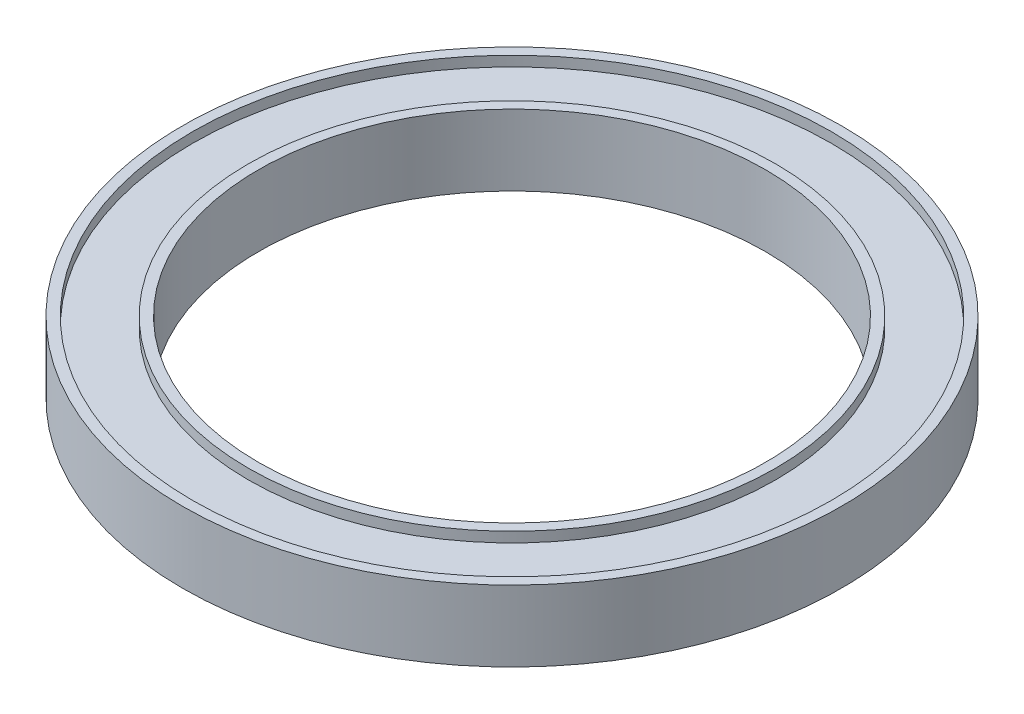
ISO-10303-21;
HEADER;
FILE_DESCRIPTION(('STEP AP214'),'2;1');
FILE_NAME('part.step','',(''),(''),'','','');
FILE_SCHEMA(('AUTOMOTIVE_DESIGN { 1 0 10303 214 1 1 1 1 }'));
ENDSEC;
DATA;
#1=APPLICATION_CONTEXT('core data for automotive mechanical design processes');
#2=APPLICATION_PROTOCOL_DEFINITION('international standard','automotive_design',2000,#1);
#3=PRODUCT_CONTEXT('',#1,'mechanical');
#4=PRODUCT('Part','Part','',(#3));
#5=PRODUCT_RELATED_PRODUCT_CATEGORY('part','',(#4));
#6=PRODUCT_DEFINITION_FORMATION('','',#4);
#7=PRODUCT_DEFINITION_CONTEXT('part definition',#1,'design');
#8=PRODUCT_DEFINITION('design','',#6,#7);
#9=PRODUCT_DEFINITION_SHAPE('','',#8);
#10=(LENGTH_UNIT() NAMED_UNIT(*) SI_UNIT(.MILLI.,.METRE.));
#11=(NAMED_UNIT(*) PLANE_ANGLE_UNIT() SI_UNIT($,.RADIAN.));
#12=(NAMED_UNIT(*) SI_UNIT($,.STERADIAN.) SOLID_ANGLE_UNIT());
#13=UNCERTAINTY_MEASURE_WITH_UNIT(LENGTH_MEASURE(1.E-05),#10,'distance_accuracy_value','');
#14=(GEOMETRIC_REPRESENTATION_CONTEXT(3) GLOBAL_UNCERTAINTY_ASSIGNED_CONTEXT((#13)) GLOBAL_UNIT_ASSIGNED_CONTEXT((#10,
#11,#12)) REPRESENTATION_CONTEXT('',''));
#15=CARTESIAN_POINT('',(0.,0.,0.));
#16=DIRECTION('',(0.,0.,1.));
#17=DIRECTION('',(1.,0.,0.));
#18=AXIS2_PLACEMENT_3D('',#15,#16,#17);
#19=CARTESIAN_POINT('',(0.,0.,0.));
#20=DIRECTION('',(0.,1.,0.));
#21=DIRECTION('',(0.,0.,1.));
#22=AXIS2_PLACEMENT_3D('',#19,#20,#21);
#23=PLANE('',#22);
#24=CARTESIAN_POINT('',(0.,0.,0.));
#25=DIRECTION('',(0.,1.,0.));
#26=DIRECTION('',(0.,0.,1.));
#27=AXIS2_PLACEMENT_3D('',#24,#25,#26);
#28=CIRCLE('',#27,25.);
#29=CARTESIAN_POINT('',(0.,0.,-25.));
#30=VERTEX_POINT('',#29);
#31=EDGE_CURVE('E44',#30,#30,#28,.T.);
#32=ORIENTED_EDGE('',*,*,#31,.T.);
#33=EDGE_LOOP('',(#32));
#34=FACE_BOUND('',#33,.T.);
#35=CARTESIAN_POINT('',(0.,0.,0.));
#36=DIRECTION('',(0.,1.,0.));
#37=DIRECTION('',(0.,0.,1.));
#38=AXIS2_PLACEMENT_3D('',#35,#36,#37);
#39=CIRCLE('',#38,26.);
#40=CARTESIAN_POINT('',(0.,0.,26.));
#41=VERTEX_POINT('',#40);
#42=EDGE_CURVE('E62',#41,#41,#39,.T.);
#43=ORIENTED_EDGE('',*,*,#42,.F.);
#44=EDGE_LOOP('',(#43));
#45=FACE_BOUND('',#44,.T.);
#46=ADVANCED_FACE('F31',(#34,#45),#23,.F.);
#47=CARTESIAN_POINT('',(0.,7.,0.));
#48=DIRECTION('',(0.,1.,0.));
#49=DIRECTION('',(0.,0.,1.));
#50=AXIS2_PLACEMENT_3D('',#47,#48,#49);
#51=PLANE('',#50);
#52=CARTESIAN_POINT('',(0.,7.,0.));
#53=DIRECTION('',(0.,1.,0.));
#54=DIRECTION('',(0.,0.,1.));
#55=AXIS2_PLACEMENT_3D('',#52,#53,#54);
#56=CIRCLE('',#55,25.);
#57=CARTESIAN_POINT('',(0.,7.,-25.));
#58=VERTEX_POINT('',#57);
#59=EDGE_CURVE('E42',#58,#58,#56,.T.);
#60=ORIENTED_EDGE('',*,*,#59,.F.);
#61=EDGE_LOOP('',(#60));
#62=FACE_BOUND('',#61,.T.);
#63=CARTESIAN_POINT('',(0.,7.,0.));
#64=DIRECTION('',(0.,1.,0.));
#65=DIRECTION('',(0.,0.,1.));
#66=AXIS2_PLACEMENT_3D('',#63,#64,#65);
#67=CIRCLE('',#66,26.);
#68=CARTESIAN_POINT('',(0.,7.,26.));
#69=VERTEX_POINT('',#68);
#70=EDGE_CURVE('E52',#69,#69,#67,.T.);
#71=ORIENTED_EDGE('',*,*,#70,.T.);
#72=EDGE_LOOP('',(#71));
#73=FACE_BOUND('',#72,.T.);
#74=ADVANCED_FACE('F88',(#62,#73),#51,.T.);
#75=CARTESIAN_POINT('',(0.,7.,0.));
#76=DIRECTION('',(0.,1.,0.));
#77=DIRECTION('',(0.,0.,1.));
#78=AXIS2_PLACEMENT_3D('',#75,#76,#77);
#79=CIRCLE('',#78,31.5);
#80=CARTESIAN_POINT('',(0.,7.,31.5));
#81=VERTEX_POINT('',#80);
#82=EDGE_CURVE('E47',#81,#81,#79,.T.);
#83=ORIENTED_EDGE('',*,*,#82,.F.);
#84=EDGE_LOOP('',(#83));
#85=FACE_BOUND('',#84,.T.);
#86=CARTESIAN_POINT('',(0.,7.,0.));
#87=DIRECTION('',(0.,1.,0.));
#88=DIRECTION('',(0.,0.,1.));
#89=AXIS2_PLACEMENT_3D('',#86,#87,#88);
#90=CIRCLE('',#89,32.5);
#91=CARTESIAN_POINT('',(0.,7.,-32.5));
#92=VERTEX_POINT('',#91);
#93=EDGE_CURVE('E10',#92,#92,#90,.T.);
#94=ORIENTED_EDGE('',*,*,#93,.T.);
#95=EDGE_LOOP('',(#94));
#96=FACE_BOUND('',#95,.T.);
#97=ADVANCED_FACE('F94',(#85,#96),#51,.T.);
#98=CARTESIAN_POINT('',(0.,0.,0.));
#99=DIRECTION('',(0.,1.,0.));
#100=DIRECTION('',(0.,0.,1.));
#101=AXIS2_PLACEMENT_3D('',#98,#99,#100);
#102=CIRCLE('',#101,31.5);
#103=CARTESIAN_POINT('',(0.,0.,31.5));
#104=VERTEX_POINT('',#103);
#105=EDGE_CURVE('E56',#104,#104,#102,.T.);
#106=ORIENTED_EDGE('',*,*,#105,.T.);
#107=EDGE_LOOP('',(#106));
#108=FACE_BOUND('',#107,.T.);
#109=CARTESIAN_POINT('',(0.,0.,0.));
#110=DIRECTION('',(0.,1.,0.));
#111=DIRECTION('',(0.,0.,1.));
#112=AXIS2_PLACEMENT_3D('',#109,#110,#111);
#113=CIRCLE('',#112,32.5);
#114=CARTESIAN_POINT('',(0.,0.,-32.5));
#115=VERTEX_POINT('',#114);
#116=EDGE_CURVE('E35',#115,#115,#113,.T.);
#117=ORIENTED_EDGE('',*,*,#116,.F.);
#118=EDGE_LOOP('',(#117));
#119=FACE_BOUND('',#118,.T.);
#120=ADVANCED_FACE('F90',(#108,#119),#23,.F.);
#121=CARTESIAN_POINT('',(0.,7.,0.));
#122=DIRECTION('',(0.,-1.,0.));
#123=DIRECTION('',(0.,0.,-1.));
#124=AXIS2_PLACEMENT_3D('',#121,#122,#123);
#125=CYLINDRICAL_SURFACE('',#124,32.5);
#126=CARTESIAN_POINT('',(0.,7.,-32.5));
#127=CARTESIAN_POINT('',(0.,6.92708333333333,-32.5));
#128=CARTESIAN_POINT('',(0.,6.85416666666667,-32.5));
#129=CARTESIAN_POINT('',(0.,6.70833333333333,-32.5));
#130=CARTESIAN_POINT('',(0.,6.63541666666667,-32.5));
#131=CARTESIAN_POINT('',(0.,6.48958333333333,-32.5));
#132=CARTESIAN_POINT('',(0.,6.41666666666667,-32.5));
#133=CARTESIAN_POINT('',(0.,6.27083333333333,-32.5));
#134=CARTESIAN_POINT('',(0.,6.19791666666667,-32.5));
#135=CARTESIAN_POINT('',(0.,6.05208333333333,-32.5));
#136=CARTESIAN_POINT('',(0.,5.97916666666667,-32.5));
#137=CARTESIAN_POINT('',(0.,5.83333333333333,-32.5));
#138=CARTESIAN_POINT('',(0.,5.76041666666667,-32.5));
#139=CARTESIAN_POINT('',(0.,5.61458333333333,-32.5));
#140=CARTESIAN_POINT('',(0.,5.54166666666667,-32.5));
#141=CARTESIAN_POINT('',(0.,5.39583333333333,-32.5));
#142=CARTESIAN_POINT('',(0.,5.32291666666667,-32.5));
#143=CARTESIAN_POINT('',(0.,5.17708333333333,-32.5));
#144=CARTESIAN_POINT('',(0.,5.10416666666667,-32.5));
#145=CARTESIAN_POINT('',(0.,4.95833333333333,-32.5));
#146=CARTESIAN_POINT('',(0.,4.88541666666667,-32.5));
#147=CARTESIAN_POINT('',(0.,4.73958333333333,-32.5));
#148=CARTESIAN_POINT('',(0.,4.66666666666667,-32.5));
#149=CARTESIAN_POINT('',(0.,4.52083333333333,-32.5));
#150=CARTESIAN_POINT('',(0.,4.44791666666667,-32.5));
#151=CARTESIAN_POINT('',(0.,4.30208333333333,-32.5));
#152=CARTESIAN_POINT('',(0.,4.22916666666667,-32.5));
#153=CARTESIAN_POINT('',(0.,4.08333333333333,-32.5));
#154=CARTESIAN_POINT('',(0.,4.01041666666667,-32.5));
#155=CARTESIAN_POINT('',(0.,3.86458333333333,-32.5));
#156=CARTESIAN_POINT('',(0.,3.79166666666667,-32.5));
#157=CARTESIAN_POINT('',(0.,3.64583333333333,-32.5));
#158=CARTESIAN_POINT('',(0.,3.57291666666667,-32.5));
#159=CARTESIAN_POINT('',(0.,3.42708333333333,-32.5));
#160=CARTESIAN_POINT('',(0.,3.35416666666667,-32.5));
#161=CARTESIAN_POINT('',(0.,3.20833333333333,-32.5));
#162=CARTESIAN_POINT('',(0.,3.13541666666667,-32.5));
#163=CARTESIAN_POINT('',(0.,2.98958333333333,-32.5));
#164=CARTESIAN_POINT('',(0.,2.91666666666667,-32.5));
#165=CARTESIAN_POINT('',(0.,2.77083333333333,-32.5));
#166=CARTESIAN_POINT('',(0.,2.69791666666667,-32.5));
#167=CARTESIAN_POINT('',(0.,2.55208333333333,-32.5));
#168=CARTESIAN_POINT('',(0.,2.47916666666667,-32.5));
#169=CARTESIAN_POINT('',(0.,2.33333333333333,-32.5));
#170=CARTESIAN_POINT('',(0.,2.26041666666667,-32.5));
#171=CARTESIAN_POINT('',(0.,2.11458333333333,-32.5));
#172=CARTESIAN_POINT('',(0.,2.04166666666667,-32.5));
#173=CARTESIAN_POINT('',(0.,1.89583333333333,-32.5));
#174=CARTESIAN_POINT('',(0.,1.82291666666667,-32.5));
#175=CARTESIAN_POINT('',(0.,1.67708333333333,-32.5));
#176=CARTESIAN_POINT('',(0.,1.60416666666667,-32.5));
#177=CARTESIAN_POINT('',(0.,1.45833333333333,-32.5));
#178=CARTESIAN_POINT('',(0.,1.38541666666667,-32.5));
#179=CARTESIAN_POINT('',(0.,1.23958333333333,-32.5));
#180=CARTESIAN_POINT('',(0.,1.16666666666667,-32.5));
#181=CARTESIAN_POINT('',(0.,1.02083333333333,-32.5));
#182=CARTESIAN_POINT('',(0.,0.947916666666666,-32.5));
#183=CARTESIAN_POINT('',(0.,0.802083333333332,-32.5));
#184=CARTESIAN_POINT('',(0.,0.729166666666666,-32.5));
#185=CARTESIAN_POINT('',(0.,0.583333333333332,-32.5));
#186=CARTESIAN_POINT('',(0.,0.510416666666666,-32.5));
#187=CARTESIAN_POINT('',(0.,0.364583333333333,-32.5));
#188=CARTESIAN_POINT('',(0.,0.291666666666666,-32.5));
#189=CARTESIAN_POINT('',(0.,0.145833333333333,-32.5));
#190=CARTESIAN_POINT('',(0.,0.0729166666666657,-32.5));
#191=CARTESIAN_POINT('',(0.,0.,-32.5));
#192=B_SPLINE_CURVE_WITH_KNOTS('',3,(#126,#127,#128,#129,#130,#131,#132,#133,#134,#135,#136,
#137,#138,#139,#140,#141,#142,#143,#144,#145,#146,#147,#148,#149,#150,#151,#152,#153,#154,#155,
#156,#157,#158,#159,#160,#161,#162,#163,#164,#165,#166,#167,#168,#169,#170,#171,#172,#173,#174,
#175,#176,#177,#178,#179,#180,#181,#182,#183,#184,#185,#186,#187,#188,#189,#190,#191),
.UNSPECIFIED.,.F.,.F.,(4,2,2,2,2,2,2,2,2,2,2,2,2,2,2,2,2,2,2,2,2,2,2,2,2,2,2,2,2,2,2,2,4),(0.,
0.218749999999999,0.4375,0.65625,0.875,1.09375,1.3125,1.53125,1.75,1.96875,2.1875,2.40625,2.625,
2.84375,3.0625,3.28125,3.5,3.71875,3.9375,4.15625,4.375,4.59375,4.8125,5.03125,5.25,5.46875,
5.6875,5.90625,6.125,6.34375,6.5625,6.78125,7.),.UNSPECIFIED.);
#193=EDGE_CURVE('BSEAM33',#92,#115,#192,.T.);
#194=ORIENTED_EDGE('',*,*,#93,.F.);
#195=ORIENTED_EDGE('',*,*,#116,.T.);
#196=ORIENTED_EDGE('',*,*,#193,.T.);
#197=ORIENTED_EDGE('',*,*,#193,.F.);
#198=EDGE_LOOP('',(#194,#196,#195,#197));
#199=FACE_BOUND('',#198,.T.);
#200=ADVANCED_FACE('F33',(#199),#125,.T.);
#201=CARTESIAN_POINT('',(0.,7.,0.));
#202=DIRECTION('',(0.,-1.,0.));
#203=DIRECTION('',(0.,0.,-1.));
#204=AXIS2_PLACEMENT_3D('',#201,#202,#203);
#205=CYLINDRICAL_SURFACE('',#204,25.);
#206=CARTESIAN_POINT('',(0.,7.,-25.));
#207=CARTESIAN_POINT('',(0.,6.92708333333333,-25.));
#208=CARTESIAN_POINT('',(0.,6.85416666666667,-25.));
#209=CARTESIAN_POINT('',(0.,6.70833333333333,-25.));
#210=CARTESIAN_POINT('',(0.,6.63541666666667,-25.));
#211=CARTESIAN_POINT('',(0.,6.48958333333333,-25.));
#212=CARTESIAN_POINT('',(0.,6.41666666666667,-25.));
#213=CARTESIAN_POINT('',(0.,6.27083333333333,-25.));
#214=CARTESIAN_POINT('',(0.,6.19791666666667,-25.));
#215=CARTESIAN_POINT('',(0.,6.05208333333333,-25.));
#216=CARTESIAN_POINT('',(0.,5.97916666666667,-25.));
#217=CARTESIAN_POINT('',(0.,5.83333333333333,-25.));
#218=CARTESIAN_POINT('',(0.,5.76041666666667,-25.));
#219=CARTESIAN_POINT('',(0.,5.61458333333333,-25.));
#220=CARTESIAN_POINT('',(0.,5.54166666666667,-25.));
#221=CARTESIAN_POINT('',(0.,5.39583333333333,-25.));
#222=CARTESIAN_POINT('',(0.,5.32291666666667,-25.));
#223=CARTESIAN_POINT('',(0.,5.17708333333333,-25.));
#224=CARTESIAN_POINT('',(0.,5.10416666666667,-25.));
#225=CARTESIAN_POINT('',(0.,4.95833333333333,-25.));
#226=CARTESIAN_POINT('',(0.,4.88541666666667,-25.));
#227=CARTESIAN_POINT('',(0.,4.73958333333333,-25.));
#228=CARTESIAN_POINT('',(0.,4.66666666666667,-25.));
#229=CARTESIAN_POINT('',(0.,4.52083333333333,-25.));
#230=CARTESIAN_POINT('',(0.,4.44791666666667,-25.));
#231=CARTESIAN_POINT('',(0.,4.30208333333333,-25.));
#232=CARTESIAN_POINT('',(0.,4.22916666666667,-25.));
#233=CARTESIAN_POINT('',(0.,4.08333333333333,-25.));
#234=CARTESIAN_POINT('',(0.,4.01041666666667,-25.));
#235=CARTESIAN_POINT('',(0.,3.86458333333333,-25.));
#236=CARTESIAN_POINT('',(0.,3.79166666666667,-25.));
#237=CARTESIAN_POINT('',(0.,3.64583333333333,-25.));
#238=CARTESIAN_POINT('',(0.,3.57291666666667,-25.));
#239=CARTESIAN_POINT('',(0.,3.42708333333333,-25.));
#240=CARTESIAN_POINT('',(0.,3.35416666666667,-25.));
#241=CARTESIAN_POINT('',(0.,3.20833333333333,-25.));
#242=CARTESIAN_POINT('',(0.,3.13541666666667,-25.));
#243=CARTESIAN_POINT('',(0.,2.98958333333333,-25.));
#244=CARTESIAN_POINT('',(0.,2.91666666666667,-25.));
#245=CARTESIAN_POINT('',(0.,2.77083333333333,-25.));
#246=CARTESIAN_POINT('',(0.,2.69791666666667,-25.));
#247=CARTESIAN_POINT('',(0.,2.55208333333333,-25.));
#248=CARTESIAN_POINT('',(0.,2.47916666666667,-25.));
#249=CARTESIAN_POINT('',(0.,2.33333333333333,-25.));
#250=CARTESIAN_POINT('',(0.,2.26041666666667,-25.));
#251=CARTESIAN_POINT('',(0.,2.11458333333333,-25.));
#252=CARTESIAN_POINT('',(0.,2.04166666666667,-25.));
#253=CARTESIAN_POINT('',(0.,1.89583333333333,-25.));
#254=CARTESIAN_POINT('',(0.,1.82291666666667,-25.));
#255=CARTESIAN_POINT('',(0.,1.67708333333333,-25.));
#256=CARTESIAN_POINT('',(0.,1.60416666666667,-25.));
#257=CARTESIAN_POINT('',(0.,1.45833333333333,-25.));
#258=CARTESIAN_POINT('',(0.,1.38541666666667,-25.));
#259=CARTESIAN_POINT('',(0.,1.23958333333333,-25.));
#260=CARTESIAN_POINT('',(0.,1.16666666666667,-25.));
#261=CARTESIAN_POINT('',(0.,1.02083333333333,-25.));
#262=CARTESIAN_POINT('',(0.,0.947916666666666,-25.));
#263=CARTESIAN_POINT('',(0.,0.802083333333332,-25.));
#264=CARTESIAN_POINT('',(0.,0.729166666666666,-25.));
#265=CARTESIAN_POINT('',(0.,0.583333333333332,-25.));
#266=CARTESIAN_POINT('',(0.,0.510416666666666,-25.));
#267=CARTESIAN_POINT('',(0.,0.364583333333333,-25.));
#268=CARTESIAN_POINT('',(0.,0.291666666666666,-25.));
#269=CARTESIAN_POINT('',(0.,0.145833333333333,-25.));
#270=CARTESIAN_POINT('',(0.,0.0729166666666657,-25.));
#271=CARTESIAN_POINT('',(0.,0.,-25.));
#272=B_SPLINE_CURVE_WITH_KNOTS('',3,(#206,#207,#208,#209,#210,#211,#212,#213,#214,#215,#216,
#217,#218,#219,#220,#221,#222,#223,#224,#225,#226,#227,#228,#229,#230,#231,#232,#233,#234,#235,
#236,#237,#238,#239,#240,#241,#242,#243,#244,#245,#246,#247,#248,#249,#250,#251,#252,#253,#254,
#255,#256,#257,#258,#259,#260,#261,#262,#263,#264,#265,#266,#267,#268,#269,#270,#271),
.UNSPECIFIED.,.F.,.F.,(4,2,2,2,2,2,2,2,2,2,2,2,2,2,2,2,2,2,2,2,2,2,2,2,2,2,2,2,2,2,2,2,4),(0.,
0.218749999999999,0.4375,0.65625,0.875,1.09375,1.3125,1.53125,1.75,1.96875,2.1875,2.40625,2.625,
2.84375,3.0625,3.28125,3.5,3.71875,3.9375,4.15625,4.375,4.59375,4.8125,5.03125,5.25,5.46875,
5.6875,5.90625,6.125,6.34375,6.5625,6.78125,7.),.UNSPECIFIED.);
#273=EDGE_CURVE('BSEAM104',#58,#30,#272,.T.);
#274=ORIENTED_EDGE('',*,*,#59,.T.);
#275=ORIENTED_EDGE('',*,*,#31,.F.);
#276=ORIENTED_EDGE('',*,*,#273,.T.);
#277=ORIENTED_EDGE('',*,*,#273,.F.);
#278=EDGE_LOOP('',(#274,#276,#275,#277));
#279=FACE_BOUND('',#278,.T.);
#280=ADVANCED_FACE('F104',(#279),#205,.F.);
#281=CARTESIAN_POINT('',(0.,6.5,0.));
#282=DIRECTION('',(0.,1.,0.));
#283=DIRECTION('',(0.,0.,1.));
#284=AXIS2_PLACEMENT_3D('',#281,#282,#283);
#285=CYLINDRICAL_SURFACE('',#284,31.5);
#286=ORIENTED_EDGE('',*,*,#82,.T.);
#287=EDGE_LOOP('',(#286));
#288=FACE_BOUND('',#287,.T.);
#289=CARTESIAN_POINT('',(0.,6.,0.));
#290=DIRECTION('',(0.,1.,0.));
#291=DIRECTION('',(0.,0.,1.));
#292=AXIS2_PLACEMENT_3D('',#289,#290,#291);
#293=CIRCLE('',#292,31.5);
#294=CARTESIAN_POINT('',(0.,6.,31.5));
#295=VERTEX_POINT('',#294);
#296=EDGE_CURVE('E65',#295,#295,#293,.T.);
#297=ORIENTED_EDGE('',*,*,#296,.F.);
#298=EDGE_LOOP('',(#297));
#299=FACE_BOUND('',#298,.T.);
#300=ADVANCED_FACE('F124',(#288,#299),#285,.F.);
#301=CARTESIAN_POINT('',(0.,6.5,0.));
#302=DIRECTION('',(0.,1.,0.));
#303=DIRECTION('',(0.,0.,1.));
#304=AXIS2_PLACEMENT_3D('',#301,#302,#303);
#305=CYLINDRICAL_SURFACE('',#304,26.);
#306=ORIENTED_EDGE('',*,*,#70,.F.);
#307=EDGE_LOOP('',(#306));
#308=FACE_BOUND('',#307,.T.);
#309=CARTESIAN_POINT('',(0.,6.,0.));
#310=DIRECTION('',(0.,1.,0.));
#311=DIRECTION('',(0.,0.,1.));
#312=AXIS2_PLACEMENT_3D('',#309,#310,#311);
#313=CIRCLE('',#312,26.);
#314=CARTESIAN_POINT('',(0.,6.,26.));
#315=VERTEX_POINT('',#314);
#316=EDGE_CURVE('E70',#315,#315,#313,.T.);
#317=ORIENTED_EDGE('',*,*,#316,.T.);
#318=EDGE_LOOP('',(#317));
#319=FACE_BOUND('',#318,.T.);
#320=ADVANCED_FACE('F74',(#308,#319),#305,.T.);
#321=CARTESIAN_POINT('',(0.,0.5,0.));
#322=DIRECTION('',(0.,-1.,0.));
#323=DIRECTION('',(0.,0.,1.));
#324=AXIS2_PLACEMENT_3D('',#321,#322,#323);
#325=PLANE('',#324);
#326=CARTESIAN_POINT('',(0.,0.5,0.));
#327=DIRECTION('',(0.,1.,0.));
#328=DIRECTION('',(0.,0.,1.));
#329=AXIS2_PLACEMENT_3D('',#326,#327,#328);
#330=CIRCLE('',#329,31.5);
#331=CARTESIAN_POINT('',(0.,0.5,31.5));
#332=VERTEX_POINT('',#331);
#333=EDGE_CURVE('E55',#332,#332,#330,.T.);
#334=ORIENTED_EDGE('',*,*,#333,.F.);
#335=EDGE_LOOP('',(#334));
#336=FACE_BOUND('',#335,.T.);
#337=CARTESIAN_POINT('',(0.,0.5,0.));
#338=DIRECTION('',(0.,1.,0.));
#339=DIRECTION('',(0.,0.,1.));
#340=AXIS2_PLACEMENT_3D('',#337,#338,#339);
#341=CIRCLE('',#340,26.);
#342=CARTESIAN_POINT('',(0.,0.5,26.));
#343=VERTEX_POINT('',#342);
#344=EDGE_CURVE('E59',#343,#343,#341,.T.);
#345=ORIENTED_EDGE('',*,*,#344,.T.);
#346=EDGE_LOOP('',(#345));
#347=FACE_BOUND('',#346,.T.);
#348=ADVANCED_FACE('F113',(#336,#347),#325,.T.);
#349=CARTESIAN_POINT('',(0.,0.5,0.));
#350=DIRECTION('',(0.,-1.,0.));
#351=DIRECTION('',(0.,0.,-1.));
#352=AXIS2_PLACEMENT_3D('',#349,#350,#351);
#353=CYLINDRICAL_SURFACE('',#352,31.5);
#354=ORIENTED_EDGE('',*,*,#333,.T.);
#355=EDGE_LOOP('',(#354));
#356=FACE_BOUND('',#355,.T.);
#357=ORIENTED_EDGE('',*,*,#105,.F.);
#358=EDGE_LOOP('',(#357));
#359=FACE_BOUND('',#358,.T.);
#360=ADVANCED_FACE('F84',(#356,#359),#353,.F.);
#361=CARTESIAN_POINT('',(0.,0.5,0.));
#362=DIRECTION('',(0.,-1.,0.));
#363=DIRECTION('',(0.,0.,-1.));
#364=AXIS2_PLACEMENT_3D('',#361,#362,#363);
#365=CYLINDRICAL_SURFACE('',#364,26.);
#366=ORIENTED_EDGE('',*,*,#344,.F.);
#367=EDGE_LOOP('',(#366));
#368=FACE_BOUND('',#367,.T.);
#369=ORIENTED_EDGE('',*,*,#42,.T.);
#370=EDGE_LOOP('',(#369));
#371=FACE_BOUND('',#370,.T.);
#372=ADVANCED_FACE('F78',(#368,#371),#365,.T.);
#373=CARTESIAN_POINT('',(0.,6.,0.));
#374=DIRECTION('',(0.,-1.,0.));
#375=DIRECTION('',(0.,0.,1.));
#376=AXIS2_PLACEMENT_3D('',#373,#374,#375);
#377=PLANE('',#376);
#378=ORIENTED_EDGE('',*,*,#296,.T.);
#379=EDGE_LOOP('',(#378));
#380=FACE_BOUND('',#379,.T.);
#381=ORIENTED_EDGE('',*,*,#316,.F.);
#382=EDGE_LOOP('',(#381));
#383=FACE_BOUND('',#382,.T.);
#384=ADVANCED_FACE('F76',(#380,#383),#377,.F.);
#385=CLOSED_SHELL('',(#46,#74,#97,#120,#200,#280,#300,#320,#348,#360,#372,#384));
#386=MANIFOLD_SOLID_BREP('B2',#385);
#387=ADVANCED_BREP_SHAPE_REPRESENTATION('',(#18,#386),#14);
#388=SHAPE_DEFINITION_REPRESENTATION(#9,#387);
ENDSEC;
END-ISO-10303-21;
